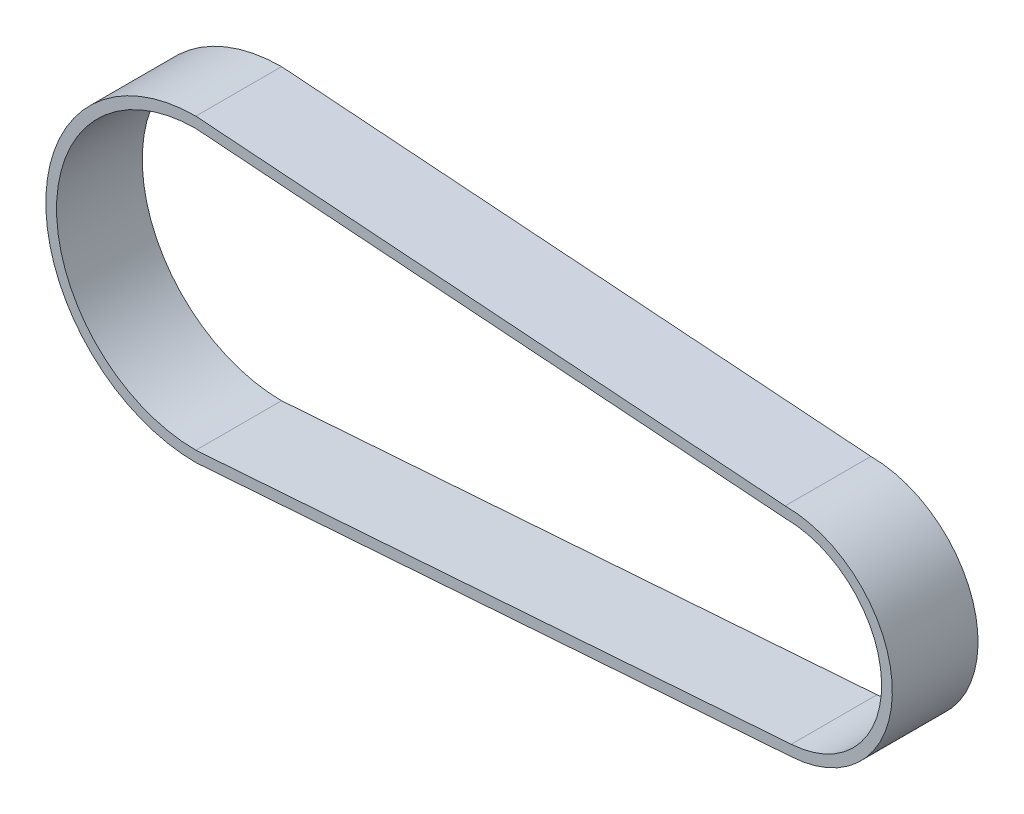
ISO-10303-21;
HEADER;
FILE_DESCRIPTION(('STEP AP214'),'2;1');
FILE_NAME('part.step','',(''),(''),'','','');
FILE_SCHEMA(('AUTOMOTIVE_DESIGN { 1 0 10303 214 1 1 1 1 }'));
ENDSEC;
DATA;
#1=APPLICATION_CONTEXT('core data for automotive mechanical design processes');
#2=APPLICATION_PROTOCOL_DEFINITION('international standard','automotive_design',2000,#1);
#3=PRODUCT_CONTEXT('',#1,'mechanical');
#4=PRODUCT('Part','Part','',(#3));
#5=PRODUCT_RELATED_PRODUCT_CATEGORY('part','',(#4));
#6=PRODUCT_DEFINITION_FORMATION('','',#4);
#7=PRODUCT_DEFINITION_CONTEXT('part definition',#1,'design');
#8=PRODUCT_DEFINITION('design','',#6,#7);
#9=PRODUCT_DEFINITION_SHAPE('','',#8);
#10=(LENGTH_UNIT() NAMED_UNIT(*) SI_UNIT(.MILLI.,.METRE.));
#11=(NAMED_UNIT(*) PLANE_ANGLE_UNIT() SI_UNIT($,.RADIAN.));
#12=(NAMED_UNIT(*) SI_UNIT($,.STERADIAN.) SOLID_ANGLE_UNIT());
#13=UNCERTAINTY_MEASURE_WITH_UNIT(LENGTH_MEASURE(1.E-05),#10,'distance_accuracy_value','');
#14=(GEOMETRIC_REPRESENTATION_CONTEXT(3) GLOBAL_UNCERTAINTY_ASSIGNED_CONTEXT((#13)) GLOBAL_UNIT_ASSIGNED_CONTEXT((#10,
#11,#12)) REPRESENTATION_CONTEXT('',''));
#15=CARTESIAN_POINT('',(0.,0.,0.));
#16=DIRECTION('',(0.,0.,1.));
#17=DIRECTION('',(1.,0.,0.));
#18=AXIS2_PLACEMENT_3D('',#15,#16,#17);
#19=CARTESIAN_POINT('',(-30.,0.,8.));
#20=DIRECTION('',(0.,0.,1.));
#21=DIRECTION('',(1.,0.,0.));
#22=AXIS2_PLACEMENT_3D('',#19,#20,#21);
#23=PLANE('',#22);
#24=CARTESIAN_POINT('',(-30.,0.,8.));
#25=DIRECTION('',(0.,0.,1.));
#26=DIRECTION('',(1.,0.,0.));
#27=AXIS2_PLACEMENT_3D('',#24,#25,#26);
#28=CIRCLE('',#27,14.);
#29=CARTESIAN_POINT('',(-30.,14.,8.));
#30=VERTEX_POINT('',#29);
#31=CARTESIAN_POINT('',(-30.,-14.,8.));
#32=VERTEX_POINT('',#31);
#33=EDGE_CURVE('E137',#30,#32,#28,.T.);
#34=ORIENTED_EDGE('',*,*,#33,.T.);
#35=DIRECTION('',(0.997398374231482,0.0720866359348043,0.));
#36=VECTOR('',#35,1.);
#37=CARTESIAN_POINT('',(-30.,-14.,8.));
#38=LINE('',#37,#36);
#39=CARTESIAN_POINT('',(25.5670605423943,-9.9839091713246,8.));
#40=VERTEX_POINT('',#39);
#41=EDGE_CURVE('E140',#32,#40,#38,.T.);
#42=ORIENTED_EDGE('',*,*,#41,.T.);
#43=CARTESIAN_POINT('',(25.,0.,8.));
#44=DIRECTION('',(0.,0.,1.));
#45=DIRECTION('',(-1.,0.,0.));
#46=AXIS2_PLACEMENT_3D('',#43,#44,#45);
#47=CIRCLE('',#46,10.);
#48=CARTESIAN_POINT('',(25.,10.,8.));
#49=VERTEX_POINT('',#48);
#50=EDGE_CURVE('E143',#40,#49,#47,.T.);
#51=ORIENTED_EDGE('',*,*,#50,.T.);
#52=DIRECTION('',(-0.997365816958794,0.0725356957788213,0.));
#53=VECTOR('',#52,1.);
#54=CARTESIAN_POINT('',(25.,10.,8.));
#55=LINE('',#54,#53);
#56=EDGE_CURVE('E145',#49,#30,#55,.T.);
#57=ORIENTED_EDGE('',*,*,#56,.T.);
#58=EDGE_LOOP('',(#34,#42,#51,#57));
#59=FACE_BOUND('',#58,.T.);
#60=DIRECTION('',(0.997396062026492,0.0721186207164728,0.));
#61=VECTOR('',#60,1.);
#62=CARTESIAN_POINT('',(-30.,-13.,8.));
#63=LINE('',#62,#61);
#64=CARTESIAN_POINT('',(-30.,-13.,8.));
#65=VERTEX_POINT('',#64);
#66=CARTESIAN_POINT('',(25.5670605423943,-8.9821179206944,8.));
#67=VERTEX_POINT('',#66);
#68=EDGE_CURVE('E109',#65,#67,#63,.T.);
#69=ORIENTED_EDGE('',*,*,#68,.F.);
#70=CARTESIAN_POINT('',(-30.,0.,8.));
#71=DIRECTION('',(0.,0.,1.));
#72=DIRECTION('',(1.,0.,0.));
#73=AXIS2_PLACEMENT_3D('',#70,#71,#72);
#74=CIRCLE('',#73,13.);
#75=CARTESIAN_POINT('',(-30.,13.,8.));
#76=VERTEX_POINT('',#75);
#77=EDGE_CURVE('E101',#76,#65,#74,.T.);
#78=ORIENTED_EDGE('',*,*,#77,.F.);
#79=DIRECTION('',(-0.997365816958794,0.0725356957788212,0.));
#80=VECTOR('',#79,1.);
#81=CARTESIAN_POINT('',(-30.,13.,8.));
#82=LINE('',#81,#80);
#83=CARTESIAN_POINT('',(25.,9.,8.));
#84=VERTEX_POINT('',#83);
#85=EDGE_CURVE('E123',#84,#76,#82,.T.);
#86=ORIENTED_EDGE('',*,*,#85,.F.);
#87=CARTESIAN_POINT('',(25.,0.,8.));
#88=DIRECTION('',(0.,0.,1.));
#89=DIRECTION('',(1.,0.,0.));
#90=AXIS2_PLACEMENT_3D('',#87,#88,#89);
#91=CIRCLE('',#90,9.);
#92=EDGE_CURVE('E121',#67,#84,#91,.T.);
#93=ORIENTED_EDGE('',*,*,#92,.F.);
#94=EDGE_LOOP('',(#69,#78,#86,#93));
#95=FACE_BOUND('',#94,.T.);
#96=ADVANCED_FACE('F36',(#59,#95),#23,.T.);
#97=CARTESIAN_POINT('',(-30.,0.,0.));
#98=DIRECTION('',(0.,0.,1.));
#99=DIRECTION('',(1.,0.,0.));
#100=AXIS2_PLACEMENT_3D('',#97,#98,#99);
#101=PLANE('',#100);
#102=CARTESIAN_POINT('',(-30.,0.,0.));
#103=DIRECTION('',(0.,0.,1.));
#104=DIRECTION('',(1.,0.,0.));
#105=AXIS2_PLACEMENT_3D('',#102,#103,#104);
#106=CIRCLE('',#105,14.);
#107=CARTESIAN_POINT('',(-30.,14.,0.));
#108=VERTEX_POINT('',#107);
#109=CARTESIAN_POINT('',(-30.,-14.,0.));
#110=VERTEX_POINT('',#109);
#111=EDGE_CURVE('E117',#108,#110,#106,.T.);
#112=ORIENTED_EDGE('',*,*,#111,.F.);
#113=DIRECTION('',(-0.997365816958794,0.0725356957788213,0.));
#114=VECTOR('',#113,1.);
#115=CARTESIAN_POINT('',(25.,10.,0.));
#116=LINE('',#115,#114);
#117=CARTESIAN_POINT('',(25.,10.,0.));
#118=VERTEX_POINT('',#117);
#119=EDGE_CURVE('E141',#118,#108,#116,.T.);
#120=ORIENTED_EDGE('',*,*,#119,.F.);
#121=CARTESIAN_POINT('',(25.,0.,0.));
#122=DIRECTION('',(0.,0.,1.));
#123=DIRECTION('',(-1.,0.,0.));
#124=AXIS2_PLACEMENT_3D('',#121,#122,#123);
#125=CIRCLE('',#124,10.);
#126=CARTESIAN_POINT('',(25.5670605423943,-9.9839091713246,0.));
#127=VERTEX_POINT('',#126);
#128=EDGE_CURVE('E152',#127,#118,#125,.T.);
#129=ORIENTED_EDGE('',*,*,#128,.F.);
#130=DIRECTION('',(0.997398374231482,0.0720866359348043,0.));
#131=VECTOR('',#130,1.);
#132=CARTESIAN_POINT('',(-30.,-14.,0.));
#133=LINE('',#132,#131);
#134=EDGE_CURVE('E150',#110,#127,#133,.T.);
#135=ORIENTED_EDGE('',*,*,#134,.F.);
#136=EDGE_LOOP('',(#112,#120,#129,#135));
#137=FACE_BOUND('',#136,.T.);
#138=CARTESIAN_POINT('',(-30.,0.,0.));
#139=DIRECTION('',(0.,0.,1.));
#140=DIRECTION('',(1.,0.,0.));
#141=AXIS2_PLACEMENT_3D('',#138,#139,#140);
#142=CIRCLE('',#141,13.);
#143=CARTESIAN_POINT('',(-30.,13.,0.));
#144=VERTEX_POINT('',#143);
#145=CARTESIAN_POINT('',(-30.,-13.,0.));
#146=VERTEX_POINT('',#145);
#147=EDGE_CURVE('E59',#144,#146,#142,.T.);
#148=ORIENTED_EDGE('',*,*,#147,.T.);
#149=DIRECTION('',(0.997396062026492,0.0721186207164728,0.));
#150=VECTOR('',#149,1.);
#151=CARTESIAN_POINT('',(-30.,-13.,0.));
#152=LINE('',#151,#150);
#153=CARTESIAN_POINT('',(25.5670605423943,-8.9821179206944,0.));
#154=VERTEX_POINT('',#153);
#155=EDGE_CURVE('E116',#146,#154,#152,.T.);
#156=ORIENTED_EDGE('',*,*,#155,.T.);
#157=CARTESIAN_POINT('',(25.,0.,0.));
#158=DIRECTION('',(0.,0.,1.));
#159=DIRECTION('',(1.,0.,0.));
#160=AXIS2_PLACEMENT_3D('',#157,#158,#159);
#161=CIRCLE('',#160,9.);
#162=CARTESIAN_POINT('',(25.,9.,0.));
#163=VERTEX_POINT('',#162);
#164=EDGE_CURVE('E129',#154,#163,#161,.T.);
#165=ORIENTED_EDGE('',*,*,#164,.T.);
#166=DIRECTION('',(-0.997365816958794,0.0725356957788212,0.));
#167=VECTOR('',#166,1.);
#168=CARTESIAN_POINT('',(-30.,13.,0.));
#169=LINE('',#168,#167);
#170=EDGE_CURVE('E110',#163,#144,#169,.T.);
#171=ORIENTED_EDGE('',*,*,#170,.T.);
#172=EDGE_LOOP('',(#148,#156,#165,#171));
#173=FACE_BOUND('',#172,.T.);
#174=ADVANCED_FACE('F170',(#137,#173),#101,.F.);
#175=CARTESIAN_POINT('',(-30.,0.,8.));
#176=DIRECTION('',(0.,0.,-1.));
#177=DIRECTION('',(-1.,0.,0.));
#178=AXIS2_PLACEMENT_3D('',#175,#176,#177);
#179=CYLINDRICAL_SURFACE('',#178,14.);
#180=ORIENTED_EDGE('',*,*,#111,.T.);
#181=DIRECTION('',(0.,0.,-1.));
#182=VECTOR('',#181,1.);
#183=CARTESIAN_POINT('',(-30.,-14.,8.));
#184=LINE('',#183,#182);
#185=EDGE_CURVE('E11',#32,#110,#184,.T.);
#186=ORIENTED_EDGE('',*,*,#185,.F.);
#187=ORIENTED_EDGE('',*,*,#33,.F.);
#188=DIRECTION('',(0.,0.,-1.));
#189=VECTOR('',#188,1.);
#190=CARTESIAN_POINT('',(-30.,14.,8.));
#191=LINE('',#190,#189);
#192=EDGE_CURVE('E147',#30,#108,#191,.T.);
#193=ORIENTED_EDGE('',*,*,#192,.T.);
#194=EDGE_LOOP('',(#180,#186,#187,#193));
#195=FACE_BOUND('',#194,.T.);
#196=ADVANCED_FACE('F38',(#195),#179,.T.);
#197=CARTESIAN_POINT('',(-30.,-14.,8.));
#198=DIRECTION('',(-0.0720866359348043,0.997398374231482,0.));
#199=DIRECTION('',(-0.997398374231482,-0.0720866359348043,0.));
#200=AXIS2_PLACEMENT_3D('',#197,#198,#199);
#201=PLANE('',#200);
#202=ORIENTED_EDGE('',*,*,#134,.T.);
#203=DIRECTION('',(0.,0.,-1.));
#204=VECTOR('',#203,1.);
#205=CARTESIAN_POINT('',(25.5670605423943,-9.9839091713246,8.));
#206=LINE('',#205,#204);
#207=EDGE_CURVE('E44',#40,#127,#206,.T.);
#208=ORIENTED_EDGE('',*,*,#207,.F.);
#209=ORIENTED_EDGE('',*,*,#41,.F.);
#210=ORIENTED_EDGE('',*,*,#185,.T.);
#211=EDGE_LOOP('',(#202,#208,#209,#210));
#212=FACE_BOUND('',#211,.T.);
#213=ADVANCED_FACE('F180',(#212),#201,.F.);
#214=CARTESIAN_POINT('',(25.,0.,8.));
#215=DIRECTION('',(0.,0.,-1.));
#216=DIRECTION('',(-1.,0.,0.));
#217=AXIS2_PLACEMENT_3D('',#214,#215,#216);
#218=CYLINDRICAL_SURFACE('',#217,10.);
#219=ORIENTED_EDGE('',*,*,#128,.T.);
#220=DIRECTION('',(0.,0.,-1.));
#221=VECTOR('',#220,1.);
#222=CARTESIAN_POINT('',(25.,10.,8.));
#223=LINE('',#222,#221);
#224=EDGE_CURVE('E157',#49,#118,#223,.T.);
#225=ORIENTED_EDGE('',*,*,#224,.F.);
#226=ORIENTED_EDGE('',*,*,#50,.F.);
#227=ORIENTED_EDGE('',*,*,#207,.T.);
#228=EDGE_LOOP('',(#219,#225,#226,#227));
#229=FACE_BOUND('',#228,.T.);
#230=ADVANCED_FACE('F164',(#229),#218,.T.);
#231=CARTESIAN_POINT('',(25.,10.,8.));
#232=DIRECTION('',(-0.0725356957788213,-0.997365816958794,0.));
#233=DIRECTION('',(0.997365816958794,-0.0725356957788213,0.));
#234=AXIS2_PLACEMENT_3D('',#231,#232,#233);
#235=PLANE('',#234);
#236=ORIENTED_EDGE('',*,*,#119,.T.);
#237=ORIENTED_EDGE('',*,*,#192,.F.);
#238=ORIENTED_EDGE('',*,*,#56,.F.);
#239=ORIENTED_EDGE('',*,*,#224,.T.);
#240=EDGE_LOOP('',(#236,#237,#238,#239));
#241=FACE_BOUND('',#240,.T.);
#242=ADVANCED_FACE('F174',(#241),#235,.F.);
#243=CARTESIAN_POINT('',(-30.,0.,8.));
#244=DIRECTION('',(0.,0.,-1.));
#245=DIRECTION('',(-1.,0.,0.));
#246=AXIS2_PLACEMENT_3D('',#243,#244,#245);
#247=CYLINDRICAL_SURFACE('',#246,13.);
#248=ORIENTED_EDGE('',*,*,#147,.F.);
#249=DIRECTION('',(0.,0.,-1.));
#250=VECTOR('',#249,1.);
#251=CARTESIAN_POINT('',(-30.,13.,8.));
#252=LINE('',#251,#250);
#253=EDGE_CURVE('E105',#76,#144,#252,.T.);
#254=ORIENTED_EDGE('',*,*,#253,.F.);
#255=ORIENTED_EDGE('',*,*,#77,.T.);
#256=DIRECTION('',(0.,0.,-1.));
#257=VECTOR('',#256,1.);
#258=CARTESIAN_POINT('',(-30.,-13.,8.));
#259=LINE('',#258,#257);
#260=EDGE_CURVE('E104',#65,#146,#259,.T.);
#261=ORIENTED_EDGE('',*,*,#260,.T.);
#262=EDGE_LOOP('',(#248,#254,#255,#261));
#263=FACE_BOUND('',#262,.T.);
#264=ADVANCED_FACE('F103',(#263),#247,.F.);
#265=CARTESIAN_POINT('',(-30.,-13.,8.));
#266=DIRECTION('',(-0.0721186207164728,0.997396062026492,0.));
#267=DIRECTION('',(-0.997396062026492,-0.0721186207164728,0.));
#268=AXIS2_PLACEMENT_3D('',#265,#266,#267);
#269=PLANE('',#268);
#270=ORIENTED_EDGE('',*,*,#155,.F.);
#271=ORIENTED_EDGE('',*,*,#260,.F.);
#272=ORIENTED_EDGE('',*,*,#68,.T.);
#273=DIRECTION('',(0.,0.,-1.));
#274=VECTOR('',#273,1.);
#275=CARTESIAN_POINT('',(25.5670605423943,-8.9821179206944,8.));
#276=LINE('',#275,#274);
#277=EDGE_CURVE('E118',#67,#154,#276,.T.);
#278=ORIENTED_EDGE('',*,*,#277,.T.);
#279=EDGE_LOOP('',(#270,#271,#272,#278));
#280=FACE_BOUND('',#279,.T.);
#281=ADVANCED_FACE('F113',(#280),#269,.T.);
#282=CARTESIAN_POINT('',(25.,0.,8.));
#283=DIRECTION('',(0.,0.,-1.));
#284=DIRECTION('',(-1.,0.,0.));
#285=AXIS2_PLACEMENT_3D('',#282,#283,#284);
#286=CYLINDRICAL_SURFACE('',#285,9.);
#287=ORIENTED_EDGE('',*,*,#164,.F.);
#288=ORIENTED_EDGE('',*,*,#277,.F.);
#289=ORIENTED_EDGE('',*,*,#92,.T.);
#290=DIRECTION('',(0.,0.,-1.));
#291=VECTOR('',#290,1.);
#292=CARTESIAN_POINT('',(25.,9.,8.));
#293=LINE('',#292,#291);
#294=EDGE_CURVE('E51',#84,#163,#293,.T.);
#295=ORIENTED_EDGE('',*,*,#294,.T.);
#296=EDGE_LOOP('',(#287,#288,#289,#295));
#297=FACE_BOUND('',#296,.T.);
#298=ADVANCED_FACE('F203',(#297),#286,.F.);
#299=CARTESIAN_POINT('',(-30.,13.,8.));
#300=DIRECTION('',(-0.0725356957788212,-0.997365816958794,0.));
#301=DIRECTION('',(0.997365816958794,-0.0725356957788212,0.));
#302=AXIS2_PLACEMENT_3D('',#299,#300,#301);
#303=PLANE('',#302);
#304=ORIENTED_EDGE('',*,*,#170,.F.);
#305=ORIENTED_EDGE('',*,*,#294,.F.);
#306=ORIENTED_EDGE('',*,*,#85,.T.);
#307=ORIENTED_EDGE('',*,*,#253,.T.);
#308=EDGE_LOOP('',(#304,#305,#306,#307));
#309=FACE_BOUND('',#308,.T.);
#310=ADVANCED_FACE('F207',(#309),#303,.T.);
#311=CLOSED_SHELL('',(#96,#174,#196,#213,#230,#242,#264,#281,#298,#310));
#312=MANIFOLD_SOLID_BREP('B2',#311);
#313=ADVANCED_BREP_SHAPE_REPRESENTATION('',(#18,#312),#14);
#314=SHAPE_DEFINITION_REPRESENTATION(#9,#313);
ENDSEC;
END-ISO-10303-21;
